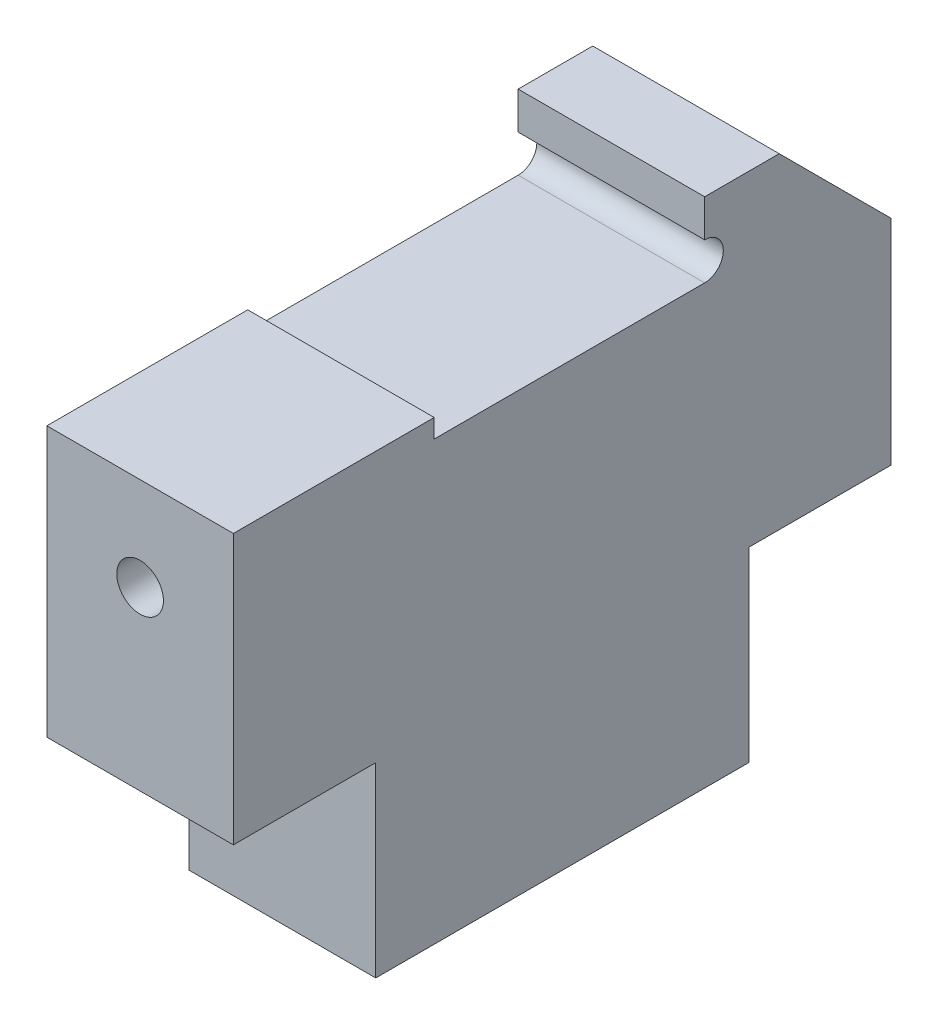
ISO-10303-21;
HEADER;
FILE_DESCRIPTION(('STEP AP214'),'2;1');
FILE_NAME('part.step','',(''),(''),'','','');
FILE_SCHEMA(('AUTOMOTIVE_DESIGN { 1 0 10303 214 1 1 1 1 }'));
ENDSEC;
DATA;
#1=APPLICATION_CONTEXT('core data for automotive mechanical design processes');
#2=APPLICATION_PROTOCOL_DEFINITION('international standard','automotive_design',2000,#1);
#3=PRODUCT_CONTEXT('',#1,'mechanical');
#4=PRODUCT('Part','Part','',(#3));
#5=PRODUCT_RELATED_PRODUCT_CATEGORY('part','',(#4));
#6=PRODUCT_DEFINITION_FORMATION('','',#4);
#7=PRODUCT_DEFINITION_CONTEXT('part definition',#1,'design');
#8=PRODUCT_DEFINITION('design','',#6,#7);
#9=PRODUCT_DEFINITION_SHAPE('','',#8);
#10=(LENGTH_UNIT() NAMED_UNIT(*) SI_UNIT(.MILLI.,.METRE.));
#11=(NAMED_UNIT(*) PLANE_ANGLE_UNIT() SI_UNIT($,.RADIAN.));
#12=(NAMED_UNIT(*) SI_UNIT($,.STERADIAN.) SOLID_ANGLE_UNIT());
#13=UNCERTAINTY_MEASURE_WITH_UNIT(LENGTH_MEASURE(1.E-05),#10,'distance_accuracy_value','');
#14=(GEOMETRIC_REPRESENTATION_CONTEXT(3) GLOBAL_UNCERTAINTY_ASSIGNED_CONTEXT((#13)) GLOBAL_UNIT_ASSIGNED_CONTEXT((#10,
#11,#12)) REPRESENTATION_CONTEXT('',''));
#15=CARTESIAN_POINT('',(0.,0.,0.));
#16=DIRECTION('',(0.,0.,1.));
#17=DIRECTION('',(1.,0.,0.));
#18=AXIS2_PLACEMENT_3D('',#15,#16,#17);
#19=CARTESIAN_POINT('',(-10.,0.,0.));
#20=DIRECTION('',(1.,0.,0.));
#21=DIRECTION('',(0.,0.,-1.));
#22=AXIS2_PLACEMENT_3D('',#19,#20,#21);
#23=CYLINDRICAL_SURFACE('',#22,1.);
#24=CARTESIAN_POINT('',(0.,0.,0.));
#25=DIRECTION('',(-1.,0.,0.));
#26=DIRECTION('',(0.,0.,-1.));
#27=AXIS2_PLACEMENT_3D('',#24,#25,#26);
#28=CIRCLE('',#27,1.);
#29=CARTESIAN_POINT('',(0.,1.,0.));
#30=VERTEX_POINT('',#29);
#31=CARTESIAN_POINT('',(0.,-1.,0.));
#32=VERTEX_POINT('',#31);
#33=EDGE_CURVE('E145',#30,#32,#28,.T.);
#34=ORIENTED_EDGE('',*,*,#33,.F.);
#35=DIRECTION('',(1.,0.,0.));
#36=VECTOR('',#35,1.);
#37=CARTESIAN_POINT('',(-10.,1.,0.));
#38=LINE('',#37,#36);
#39=CARTESIAN_POINT('',(-10.,1.,0.));
#40=VERTEX_POINT('',#39);
#41=EDGE_CURVE('E226',#40,#30,#38,.T.);
#42=ORIENTED_EDGE('',*,*,#41,.F.);
#43=CARTESIAN_POINT('',(-10.,0.,0.));
#44=DIRECTION('',(-1.,0.,0.));
#45=DIRECTION('',(0.,0.,-1.));
#46=AXIS2_PLACEMENT_3D('',#43,#44,#45);
#47=CIRCLE('',#46,1.);
#48=CARTESIAN_POINT('',(-10.,-1.,0.));
#49=VERTEX_POINT('',#48);
#50=EDGE_CURVE('E154',#40,#49,#47,.T.);
#51=ORIENTED_EDGE('',*,*,#50,.T.);
#52=DIRECTION('',(1.,0.,0.));
#53=VECTOR('',#52,1.);
#54=CARTESIAN_POINT('',(-10.,-1.,0.));
#55=LINE('',#54,#53);
#56=EDGE_CURVE('E192',#49,#32,#55,.T.);
#57=ORIENTED_EDGE('',*,*,#56,.T.);
#58=EDGE_LOOP('',(#34,#42,#51,#57));
#59=FACE_BOUND('',#58,.T.);
#60=ADVANCED_FACE('F36',(#59),#23,.F.);
#61=CARTESIAN_POINT('',(-10.,1.,0.));
#62=DIRECTION('',(0.,0.,1.));
#63=DIRECTION('',(0.,-1.,0.));
#64=AXIS2_PLACEMENT_3D('',#61,#62,#63);
#65=PLANE('',#64);
#66=DIRECTION('',(0.,-1.,0.));
#67=VECTOR('',#66,1.);
#68=CARTESIAN_POINT('',(0.,1.,0.));
#69=LINE('',#68,#67);
#70=CARTESIAN_POINT('',(0.,3.,0.));
#71=VERTEX_POINT('',#70);
#72=EDGE_CURVE('E158',#71,#30,#69,.T.);
#73=ORIENTED_EDGE('',*,*,#72,.F.);
#74=DIRECTION('',(1.,0.,0.));
#75=VECTOR('',#74,1.);
#76=CARTESIAN_POINT('',(-10.,3.,0.));
#77=LINE('',#76,#75);
#78=CARTESIAN_POINT('',(-10.,3.,0.));
#79=VERTEX_POINT('',#78);
#80=EDGE_CURVE('E229',#79,#71,#77,.T.);
#81=ORIENTED_EDGE('',*,*,#80,.F.);
#82=DIRECTION('',(0.,-1.,0.));
#83=VECTOR('',#82,1.);
#84=CARTESIAN_POINT('',(-10.,1.,0.));
#85=LINE('',#84,#83);
#86=EDGE_CURVE('E190',#79,#40,#85,.T.);
#87=ORIENTED_EDGE('',*,*,#86,.T.);
#88=ORIENTED_EDGE('',*,*,#41,.T.);
#89=EDGE_LOOP('',(#73,#81,#87,#88));
#90=FACE_BOUND('',#89,.T.);
#91=ADVANCED_FACE('F276',(#90),#65,.T.);
#92=CARTESIAN_POINT('',(-10.,3.,-10.));
#93=DIRECTION('',(0.,1.,0.));
#94=DIRECTION('',(0.,0.,1.));
#95=AXIS2_PLACEMENT_3D('',#92,#93,#94);
#96=PLANE('',#95);
#97=DIRECTION('',(0.,0.,1.));
#98=VECTOR('',#97,1.);
#99=CARTESIAN_POINT('',(0.,3.,-10.));
#100=LINE('',#99,#98);
#101=CARTESIAN_POINT('',(0.,3.,-3.99999999999998));
#102=VERTEX_POINT('',#101);
#103=EDGE_CURVE('E222',#102,#71,#100,.T.);
#104=ORIENTED_EDGE('',*,*,#103,.F.);
#105=DIRECTION('',(-1.,0.,0.));
#106=VECTOR('',#105,1.);
#107=CARTESIAN_POINT('',(-10.,3.,-3.99999999999998));
#108=LINE('',#107,#106);
#109=CARTESIAN_POINT('',(-10.,3.,-3.99999999999998));
#110=VERTEX_POINT('',#109);
#111=EDGE_CURVE('E44',#102,#110,#108,.T.);
#112=ORIENTED_EDGE('',*,*,#111,.T.);
#113=DIRECTION('',(0.,0.,1.));
#114=VECTOR('',#113,1.);
#115=CARTESIAN_POINT('',(-10.,3.,-10.));
#116=LINE('',#115,#114);
#117=EDGE_CURVE('E188',#110,#79,#116,.T.);
#118=ORIENTED_EDGE('',*,*,#117,.T.);
#119=ORIENTED_EDGE('',*,*,#80,.T.);
#120=EDGE_LOOP('',(#104,#112,#118,#119));
#121=FACE_BOUND('',#120,.T.);
#122=ADVANCED_FACE('F281',(#121),#96,.T.);
#123=CARTESIAN_POINT('',(-10.,-14.46,-10.));
#124=DIRECTION('',(0.,0.,-1.));
#125=DIRECTION('',(-1.,0.,0.));
#126=AXIS2_PLACEMENT_3D('',#123,#124,#125);
#127=PLANE('',#126);
#128=DIRECTION('',(0.,1.,0.));
#129=VECTOR('',#128,1.);
#130=CARTESIAN_POINT('',(-10.,-14.46,-10.));
#131=LINE('',#130,#129);
#132=CARTESIAN_POINT('',(-10.,-14.46,-10.));
#133=VERTEX_POINT('',#132);
#134=CARTESIAN_POINT('',(-10.,-3.,-10.));
#135=VERTEX_POINT('',#134);
#136=EDGE_CURVE('E185',#133,#135,#131,.T.);
#137=ORIENTED_EDGE('',*,*,#136,.T.);
#138=DIRECTION('',(1.,0.,0.));
#139=VECTOR('',#138,1.);
#140=CARTESIAN_POINT('',(-10.,-3.,-10.));
#141=LINE('',#140,#139);
#142=CARTESIAN_POINT('',(0.,-3.,-10.));
#143=VERTEX_POINT('',#142);
#144=EDGE_CURVE('E228',#135,#143,#141,.T.);
#145=ORIENTED_EDGE('',*,*,#144,.T.);
#146=DIRECTION('',(0.,1.,0.));
#147=VECTOR('',#146,1.);
#148=CARTESIAN_POINT('',(0.,-14.46,-10.));
#149=LINE('',#148,#147);
#150=CARTESIAN_POINT('',(0.,-14.46,-10.));
#151=VERTEX_POINT('',#150);
#152=EDGE_CURVE('E220',#151,#143,#149,.T.);
#153=ORIENTED_EDGE('',*,*,#152,.F.);
#154=DIRECTION('',(1.,0.,0.));
#155=VECTOR('',#154,1.);
#156=CARTESIAN_POINT('',(-10.,-14.46,-10.));
#157=LINE('',#156,#155);
#158=EDGE_CURVE('E232',#133,#151,#157,.T.);
#159=ORIENTED_EDGE('',*,*,#158,.F.);
#160=EDGE_LOOP('',(#137,#145,#153,#159));
#161=FACE_BOUND('',#160,.T.);
#162=ADVANCED_FACE('F256',(#161),#127,.T.);
#163=CARTESIAN_POINT('',(-10.,-14.46,-2.365));
#164=DIRECTION('',(0.,-1.,0.));
#165=DIRECTION('',(0.,0.,-1.));
#166=AXIS2_PLACEMENT_3D('',#163,#164,#165);
#167=PLANE('',#166);
#168=DIRECTION('',(0.,0.,-1.));
#169=VECTOR('',#168,1.);
#170=CARTESIAN_POINT('',(0.,-14.46,-2.365));
#171=LINE('',#170,#169);
#172=CARTESIAN_POINT('',(0.,-14.46,-2.365));
#173=VERTEX_POINT('',#172);
#174=EDGE_CURVE('E217',#173,#151,#171,.T.);
#175=ORIENTED_EDGE('',*,*,#174,.F.);
#176=DIRECTION('',(1.,0.,0.));
#177=VECTOR('',#176,1.);
#178=CARTESIAN_POINT('',(-10.,-14.46,-2.365));
#179=LINE('',#178,#177);
#180=CARTESIAN_POINT('',(-10.,-14.46,-2.365));
#181=VERTEX_POINT('',#180);
#182=EDGE_CURVE('E234',#181,#173,#179,.T.);
#183=ORIENTED_EDGE('',*,*,#182,.F.);
#184=DIRECTION('',(0.,0.,-1.));
#185=VECTOR('',#184,1.);
#186=CARTESIAN_POINT('',(-10.,-14.46,-2.365));
#187=LINE('',#186,#185);
#188=EDGE_CURVE('E182',#181,#133,#187,.T.);
#189=ORIENTED_EDGE('',*,*,#188,.T.);
#190=ORIENTED_EDGE('',*,*,#158,.T.);
#191=EDGE_LOOP('',(#175,#183,#189,#190));
#192=FACE_BOUND('',#191,.T.);
#193=ADVANCED_FACE('F264',(#192),#167,.T.);
#194=CARTESIAN_POINT('',(-10.,-24.46,-2.365));
#195=DIRECTION('',(0.,0.,-1.));
#196=DIRECTION('',(0.,1.,0.));
#197=AXIS2_PLACEMENT_3D('',#194,#195,#196);
#198=PLANE('',#197);
#199=DIRECTION('',(0.,1.,0.));
#200=VECTOR('',#199,1.);
#201=CARTESIAN_POINT('',(0.,-24.46,-2.365));
#202=LINE('',#201,#200);
#203=CARTESIAN_POINT('',(0.,-24.46,-2.365));
#204=VERTEX_POINT('',#203);
#205=EDGE_CURVE('E214',#204,#173,#202,.T.);
#206=ORIENTED_EDGE('',*,*,#205,.F.);
#207=DIRECTION('',(1.,0.,0.));
#208=VECTOR('',#207,1.);
#209=CARTESIAN_POINT('',(-10.,-24.46,-2.365));
#210=LINE('',#209,#208);
#211=CARTESIAN_POINT('',(-10.,-24.46,-2.365));
#212=VERTEX_POINT('',#211);
#213=EDGE_CURVE('E236',#212,#204,#210,.T.);
#214=ORIENTED_EDGE('',*,*,#213,.F.);
#215=DIRECTION('',(0.,1.,0.));
#216=VECTOR('',#215,1.);
#217=CARTESIAN_POINT('',(-10.,-24.46,-2.365));
#218=LINE('',#217,#216);
#219=EDGE_CURVE('E179',#212,#181,#218,.T.);
#220=ORIENTED_EDGE('',*,*,#219,.T.);
#221=ORIENTED_EDGE('',*,*,#182,.T.);
#222=EDGE_LOOP('',(#206,#214,#220,#221));
#223=FACE_BOUND('',#222,.T.);
#224=ADVANCED_FACE('F313',(#223),#198,.T.);
#225=CARTESIAN_POINT('',(-10.,-24.46,17.635));
#226=DIRECTION('',(0.,-1.,0.));
#227=DIRECTION('',(0.,0.,-1.));
#228=AXIS2_PLACEMENT_3D('',#225,#226,#227);
#229=PLANE('',#228);
#230=DIRECTION('',(0.,0.,-1.));
#231=VECTOR('',#230,1.);
#232=CARTESIAN_POINT('',(0.,-24.46,17.635));
#233=LINE('',#232,#231);
#234=CARTESIAN_POINT('',(0.,-24.46,17.635));
#235=VERTEX_POINT('',#234);
#236=EDGE_CURVE('E211',#235,#204,#233,.T.);
#237=ORIENTED_EDGE('',*,*,#236,.F.);
#238=DIRECTION('',(1.,0.,0.));
#239=VECTOR('',#238,1.);
#240=CARTESIAN_POINT('',(-10.,-24.46,17.635));
#241=LINE('',#240,#239);
#242=CARTESIAN_POINT('',(-10.,-24.46,17.635));
#243=VERTEX_POINT('',#242);
#244=EDGE_CURVE('E238',#243,#235,#241,.T.);
#245=ORIENTED_EDGE('',*,*,#244,.F.);
#246=DIRECTION('',(0.,0.,-1.));
#247=VECTOR('',#246,1.);
#248=CARTESIAN_POINT('',(-10.,-24.46,17.635));
#249=LINE('',#248,#247);
#250=EDGE_CURVE('E176',#243,#212,#249,.T.);
#251=ORIENTED_EDGE('',*,*,#250,.T.);
#252=ORIENTED_EDGE('',*,*,#213,.T.);
#253=EDGE_LOOP('',(#237,#245,#251,#252));
#254=FACE_BOUND('',#253,.T.);
#255=ADVANCED_FACE('F309',(#254),#229,.T.);
#256=CARTESIAN_POINT('',(-10.,-14.46,17.635));
#257=DIRECTION('',(0.,0.,1.));
#258=DIRECTION('',(1.,0.,0.));
#259=AXIS2_PLACEMENT_3D('',#256,#257,#258);
#260=PLANE('',#259);
#261=DIRECTION('',(0.,-1.,0.));
#262=VECTOR('',#261,1.);
#263=CARTESIAN_POINT('',(0.,-14.46,17.635));
#264=LINE('',#263,#262);
#265=CARTESIAN_POINT('',(0.,-14.46,17.635));
#266=VERTEX_POINT('',#265);
#267=EDGE_CURVE('E208',#266,#235,#264,.T.);
#268=ORIENTED_EDGE('',*,*,#267,.F.);
#269=DIRECTION('',(1.,0.,0.));
#270=VECTOR('',#269,1.);
#271=CARTESIAN_POINT('',(-10.,-14.46,17.635));
#272=LINE('',#271,#270);
#273=CARTESIAN_POINT('',(-10.,-14.46,17.635));
#274=VERTEX_POINT('',#273);
#275=EDGE_CURVE('E240',#274,#266,#272,.T.);
#276=ORIENTED_EDGE('',*,*,#275,.F.);
#277=DIRECTION('',(0.,-1.,0.));
#278=VECTOR('',#277,1.);
#279=CARTESIAN_POINT('',(-10.,-14.46,17.635));
#280=LINE('',#279,#278);
#281=EDGE_CURVE('E173',#274,#243,#280,.T.);
#282=ORIENTED_EDGE('',*,*,#281,.T.);
#283=ORIENTED_EDGE('',*,*,#244,.T.);
#284=EDGE_LOOP('',(#268,#276,#282,#283));
#285=FACE_BOUND('',#284,.T.);
#286=ADVANCED_FACE('F305',(#285),#260,.T.);
#287=CARTESIAN_POINT('',(-10.,-14.46,25.27));
#288=DIRECTION('',(0.,-1.,0.));
#289=DIRECTION('',(0.,0.,-1.));
#290=AXIS2_PLACEMENT_3D('',#287,#288,#289);
#291=PLANE('',#290);
#292=DIRECTION('',(0.,0.,-1.));
#293=VECTOR('',#292,1.);
#294=CARTESIAN_POINT('',(0.,-14.46,25.27));
#295=LINE('',#294,#293);
#296=CARTESIAN_POINT('',(0.,-14.46,25.27));
#297=VERTEX_POINT('',#296);
#298=EDGE_CURVE('E205',#297,#266,#295,.T.);
#299=ORIENTED_EDGE('',*,*,#298,.F.);
#300=DIRECTION('',(1.,0.,0.));
#301=VECTOR('',#300,1.);
#302=CARTESIAN_POINT('',(-10.,-14.46,25.27));
#303=LINE('',#302,#301);
#304=CARTESIAN_POINT('',(-10.,-14.46,25.27));
#305=VERTEX_POINT('',#304);
#306=EDGE_CURVE('E242',#305,#297,#303,.T.);
#307=ORIENTED_EDGE('',*,*,#306,.F.);
#308=DIRECTION('',(0.,0.,-1.));
#309=VECTOR('',#308,1.);
#310=CARTESIAN_POINT('',(-10.,-14.46,25.27));
#311=LINE('',#310,#309);
#312=EDGE_CURVE('E170',#305,#274,#311,.T.);
#313=ORIENTED_EDGE('',*,*,#312,.T.);
#314=ORIENTED_EDGE('',*,*,#275,.T.);
#315=EDGE_LOOP('',(#299,#307,#313,#314));
#316=FACE_BOUND('',#315,.T.);
#317=ADVANCED_FACE('F301',(#316),#291,.T.);
#318=CARTESIAN_POINT('',(-10.,0.,25.27));
#319=DIRECTION('',(0.,0.,1.));
#320=DIRECTION('',(1.,0.,0.));
#321=AXIS2_PLACEMENT_3D('',#318,#319,#320);
#322=PLANE('',#321);
#323=CARTESIAN_POINT('',(-5.,-5.,25.27));
#324=DIRECTION('',(0.,0.,1.));
#325=DIRECTION('',(1.,0.,0.));
#326=AXIS2_PLACEMENT_3D('',#323,#324,#325);
#327=CIRCLE('',#326,1.24999999999999);
#328=CARTESIAN_POINT('',(-3.75000000000001,-5.,25.27));
#329=VERTEX_POINT('',#328);
#330=EDGE_CURVE('E146',#329,#329,#327,.T.);
#331=ORIENTED_EDGE('',*,*,#330,.F.);
#332=EDGE_LOOP('',(#331));
#333=FACE_BOUND('',#332,.T.);
#334=DIRECTION('',(0.,-1.,0.));
#335=VECTOR('',#334,1.);
#336=CARTESIAN_POINT('',(0.,0.,25.27));
#337=LINE('',#336,#335);
#338=CARTESIAN_POINT('',(0.,0.,25.27));
#339=VERTEX_POINT('',#338);
#340=EDGE_CURVE('E202',#339,#297,#337,.T.);
#341=ORIENTED_EDGE('',*,*,#340,.F.);
#342=DIRECTION('',(1.,0.,0.));
#343=VECTOR('',#342,1.);
#344=CARTESIAN_POINT('',(-10.,0.,25.27));
#345=LINE('',#344,#343);
#346=CARTESIAN_POINT('',(-10.,0.,25.27));
#347=VERTEX_POINT('',#346);
#348=EDGE_CURVE('E244',#347,#339,#345,.T.);
#349=ORIENTED_EDGE('',*,*,#348,.F.);
#350=DIRECTION('',(0.,-1.,0.));
#351=VECTOR('',#350,1.);
#352=CARTESIAN_POINT('',(-10.,0.,25.27));
#353=LINE('',#352,#351);
#354=EDGE_CURVE('E167',#347,#305,#353,.T.);
#355=ORIENTED_EDGE('',*,*,#354,.T.);
#356=ORIENTED_EDGE('',*,*,#306,.T.);
#357=EDGE_LOOP('',(#341,#349,#355,#356));
#358=FACE_BOUND('',#357,.T.);
#359=ADVANCED_FACE('F297',(#333,#358),#322,.T.);
#360=CARTESIAN_POINT('',(-10.,0.,14.5));
#361=DIRECTION('',(0.,1.,0.));
#362=DIRECTION('',(0.,0.,1.));
#363=AXIS2_PLACEMENT_3D('',#360,#361,#362);
#364=PLANE('',#363);
#365=DIRECTION('',(0.,0.,1.));
#366=VECTOR('',#365,1.);
#367=CARTESIAN_POINT('',(0.,0.,14.5));
#368=LINE('',#367,#366);
#369=CARTESIAN_POINT('',(0.,0.,14.5));
#370=VERTEX_POINT('',#369);
#371=EDGE_CURVE('E199',#370,#339,#368,.T.);
#372=ORIENTED_EDGE('',*,*,#371,.F.);
#373=DIRECTION('',(1.,0.,0.));
#374=VECTOR('',#373,1.);
#375=CARTESIAN_POINT('',(-10.,0.,14.5));
#376=LINE('',#375,#374);
#377=CARTESIAN_POINT('',(-10.,0.,14.5));
#378=VERTEX_POINT('',#377);
#379=EDGE_CURVE('E246',#378,#370,#376,.T.);
#380=ORIENTED_EDGE('',*,*,#379,.F.);
#381=DIRECTION('',(0.,0.,1.));
#382=VECTOR('',#381,1.);
#383=CARTESIAN_POINT('',(-10.,0.,14.5));
#384=LINE('',#383,#382);
#385=EDGE_CURVE('E164',#378,#347,#384,.T.);
#386=ORIENTED_EDGE('',*,*,#385,.T.);
#387=ORIENTED_EDGE('',*,*,#348,.T.);
#388=EDGE_LOOP('',(#372,#380,#386,#387));
#389=FACE_BOUND('',#388,.T.);
#390=ADVANCED_FACE('F293',(#389),#364,.T.);
#391=CARTESIAN_POINT('',(-10.,-1.,14.5));
#392=DIRECTION('',(0.,0.,-1.));
#393=DIRECTION('',(-1.,0.,0.));
#394=AXIS2_PLACEMENT_3D('',#391,#392,#393);
#395=PLANE('',#394);
#396=DIRECTION('',(0.,1.,0.));
#397=VECTOR('',#396,1.);
#398=CARTESIAN_POINT('',(0.,-1.,14.5));
#399=LINE('',#398,#397);
#400=CARTESIAN_POINT('',(0.,-1.,14.5));
#401=VERTEX_POINT('',#400);
#402=EDGE_CURVE('E196',#401,#370,#399,.T.);
#403=ORIENTED_EDGE('',*,*,#402,.F.);
#404=DIRECTION('',(1.,0.,0.));
#405=VECTOR('',#404,1.);
#406=CARTESIAN_POINT('',(-10.,-1.,14.5));
#407=LINE('',#406,#405);
#408=CARTESIAN_POINT('',(-10.,-1.,14.5));
#409=VERTEX_POINT('',#408);
#410=EDGE_CURVE('E248',#409,#401,#407,.T.);
#411=ORIENTED_EDGE('',*,*,#410,.F.);
#412=DIRECTION('',(0.,1.,0.));
#413=VECTOR('',#412,1.);
#414=CARTESIAN_POINT('',(-10.,-1.,14.5));
#415=LINE('',#414,#413);
#416=EDGE_CURVE('E161',#409,#378,#415,.T.);
#417=ORIENTED_EDGE('',*,*,#416,.T.);
#418=ORIENTED_EDGE('',*,*,#379,.T.);
#419=EDGE_LOOP('',(#403,#411,#417,#418));
#420=FACE_BOUND('',#419,.T.);
#421=ADVANCED_FACE('F289',(#420),#395,.T.);
#422=CARTESIAN_POINT('',(-10.,-1.,0.));
#423=DIRECTION('',(0.,1.,0.));
#424=DIRECTION('',(0.,0.,1.));
#425=AXIS2_PLACEMENT_3D('',#422,#423,#424);
#426=PLANE('',#425);
#427=DIRECTION('',(0.,0.,1.));
#428=VECTOR('',#427,1.);
#429=CARTESIAN_POINT('',(0.,-1.,0.));
#430=LINE('',#429,#428);
#431=EDGE_CURVE('E149',#32,#401,#430,.T.);
#432=ORIENTED_EDGE('',*,*,#431,.F.);
#433=ORIENTED_EDGE('',*,*,#56,.F.);
#434=DIRECTION('',(0.,0.,1.));
#435=VECTOR('',#434,1.);
#436=CARTESIAN_POINT('',(-10.,-1.,0.));
#437=LINE('',#436,#435);
#438=EDGE_CURVE('E157',#49,#409,#437,.T.);
#439=ORIENTED_EDGE('',*,*,#438,.T.);
#440=ORIENTED_EDGE('',*,*,#410,.T.);
#441=EDGE_LOOP('',(#432,#433,#439,#440));
#442=FACE_BOUND('',#441,.T.);
#443=ADVANCED_FACE('F286',(#442),#426,.T.);
#444=CARTESIAN_POINT('',(-10.,0.,0.));
#445=DIRECTION('',(1.,0.,0.));
#446=DIRECTION('',(0.,0.,-1.));
#447=AXIS2_PLACEMENT_3D('',#444,#445,#446);
#448=PLANE('',#447);
#449=ORIENTED_EDGE('',*,*,#117,.F.);
#450=DIRECTION('',(0.,0.707106781186546,0.707106781186549));
#451=VECTOR('',#450,1.);
#452=CARTESIAN_POINT('',(-10.,-3.,-10.));
#453=LINE('',#452,#451);
#454=EDGE_CURVE('E11',#110,#135,#453,.F.);
#455=ORIENTED_EDGE('',*,*,#454,.T.);
#456=ORIENTED_EDGE('',*,*,#136,.F.);
#457=ORIENTED_EDGE('',*,*,#188,.F.);
#458=ORIENTED_EDGE('',*,*,#219,.F.);
#459=ORIENTED_EDGE('',*,*,#250,.F.);
#460=ORIENTED_EDGE('',*,*,#281,.F.);
#461=ORIENTED_EDGE('',*,*,#312,.F.);
#462=ORIENTED_EDGE('',*,*,#354,.F.);
#463=ORIENTED_EDGE('',*,*,#385,.F.);
#464=ORIENTED_EDGE('',*,*,#416,.F.);
#465=ORIENTED_EDGE('',*,*,#438,.F.);
#466=ORIENTED_EDGE('',*,*,#50,.F.);
#467=ORIENTED_EDGE('',*,*,#86,.F.);
#468=EDGE_LOOP('',(#449,#455,#456,#457,#458,#459,#460,#461,#462,#463,#464,#465,#466,#467));
#469=FACE_BOUND('',#468,.T.);
#470=ADVANCED_FACE('F267',(#469),#448,.F.);
#471=CARTESIAN_POINT('',(0.,0.,0.));
#472=DIRECTION('',(1.,0.,0.));
#473=DIRECTION('',(0.,0.,-1.));
#474=AXIS2_PLACEMENT_3D('',#471,#472,#473);
#475=PLANE('',#474);
#476=ORIENTED_EDGE('',*,*,#152,.T.);
#477=DIRECTION('',(0.,-0.707106781186546,-0.707106781186549));
#478=VECTOR('',#477,1.);
#479=CARTESIAN_POINT('',(0.,3.5,-3.49999999999998));
#480=LINE('',#479,#478);
#481=EDGE_CURVE('E58',#143,#102,#480,.F.);
#482=ORIENTED_EDGE('',*,*,#481,.T.);
#483=ORIENTED_EDGE('',*,*,#103,.T.);
#484=ORIENTED_EDGE('',*,*,#72,.T.);
#485=ORIENTED_EDGE('',*,*,#33,.T.);
#486=ORIENTED_EDGE('',*,*,#431,.T.);
#487=ORIENTED_EDGE('',*,*,#402,.T.);
#488=ORIENTED_EDGE('',*,*,#371,.T.);
#489=ORIENTED_EDGE('',*,*,#340,.T.);
#490=ORIENTED_EDGE('',*,*,#298,.T.);
#491=ORIENTED_EDGE('',*,*,#267,.T.);
#492=ORIENTED_EDGE('',*,*,#236,.T.);
#493=ORIENTED_EDGE('',*,*,#205,.T.);
#494=ORIENTED_EDGE('',*,*,#174,.T.);
#495=EDGE_LOOP('',(#476,#482,#483,#484,#485,#486,#487,#488,#489,#490,#491,#492,#493,#494));
#496=FACE_BOUND('',#495,.T.);
#497=ADVANCED_FACE('F260',(#496),#475,.T.);
#498=CARTESIAN_POINT('',(-10.,-3.,-10.));
#499=DIRECTION('',(0.,-0.707106781186549,0.707106781186546));
#500=DIRECTION('',(1.,0.,0.));
#501=AXIS2_PLACEMENT_3D('',#498,#499,#500);
#502=PLANE('',#501);
#503=ORIENTED_EDGE('',*,*,#454,.F.);
#504=ORIENTED_EDGE('',*,*,#111,.F.);
#505=ORIENTED_EDGE('',*,*,#481,.F.);
#506=ORIENTED_EDGE('',*,*,#144,.F.);
#507=EDGE_LOOP('',(#503,#504,#505,#506));
#508=FACE_BOUND('',#507,.T.);
#509=ADVANCED_FACE('F38',(#508),#502,.F.);
#510=CARTESIAN_POINT('',(-5.,-5.,10.77));
#511=DIRECTION('',(0.,0.,1.));
#512=DIRECTION('',(1.,0.,0.));
#513=AXIS2_PLACEMENT_3D('',#510,#511,#512);
#514=CONICAL_SURFACE('',#513,1.25,1.02974425867665);
#515=CARTESIAN_POINT('',(-5.,-5.,10.0189242262156));
#516=VERTEX_POINT('',#515);
#517=VERTEX_LOOP('',#516);
#518=FACE_BOUND('',#517,.T.);
#519=CARTESIAN_POINT('',(-5.,-5.,10.77));
#520=DIRECTION('',(0.,0.,1.));
#521=DIRECTION('',(1.,0.,0.));
#522=AXIS2_PLACEMENT_3D('',#519,#520,#521);
#523=CIRCLE('',#522,1.25);
#524=CARTESIAN_POINT('',(-3.75,-5.,10.77));
#525=VERTEX_POINT('',#524);
#526=EDGE_CURVE('E143',#525,#525,#523,.T.);
#527=ORIENTED_EDGE('',*,*,#526,.T.);
#528=EDGE_LOOP('',(#527));
#529=FACE_BOUND('',#528,.T.);
#530=ADVANCED_FACE('F136',(#518,#529),#514,.F.);
#531=CARTESIAN_POINT('',(-5.,-5.,25.27));
#532=DIRECTION('',(0.,0.,1.));
#533=DIRECTION('',(1.,0.,0.));
#534=AXIS2_PLACEMENT_3D('',#531,#532,#533);
#535=CYLINDRICAL_SURFACE('',#534,1.24999999999999);
#536=ORIENTED_EDGE('',*,*,#526,.F.);
#537=EDGE_LOOP('',(#536));
#538=FACE_BOUND('',#537,.T.);
#539=ORIENTED_EDGE('',*,*,#330,.T.);
#540=EDGE_LOOP('',(#539));
#541=FACE_BOUND('',#540,.T.);
#542=ADVANCED_FACE('F139',(#538,#541),#535,.F.);
#543=CLOSED_SHELL('',(#60,#91,#122,#162,#193,#224,#255,#286,#317,#359,#390,#421,#443,#470,#497,
#509,#530,#542));
#544=MANIFOLD_SOLID_BREP('B2',#543);
#545=ADVANCED_BREP_SHAPE_REPRESENTATION('',(#18,#544),#14);
#546=SHAPE_DEFINITION_REPRESENTATION(#9,#545);
ENDSEC;
END-ISO-10303-21;
